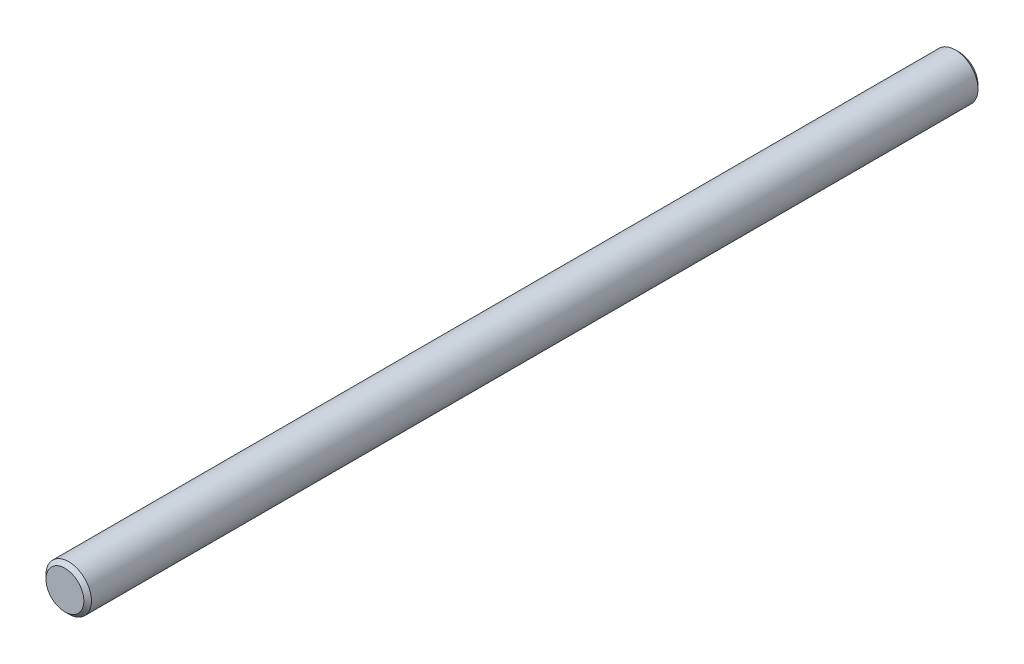
ISO-10303-21;
HEADER;
FILE_DESCRIPTION(('STEP AP214'),'2;1');
FILE_NAME('part.step','',(''),(''),'','','');
FILE_SCHEMA(('AUTOMOTIVE_DESIGN { 1 0 10303 214 1 1 1 1 }'));
ENDSEC;
DATA;
#1=APPLICATION_CONTEXT('core data for automotive mechanical design processes');
#2=APPLICATION_PROTOCOL_DEFINITION('international standard','automotive_design',2000,#1);
#3=PRODUCT_CONTEXT('',#1,'mechanical');
#4=PRODUCT('Part','Part','',(#3));
#5=PRODUCT_RELATED_PRODUCT_CATEGORY('part','',(#4));
#6=PRODUCT_DEFINITION_FORMATION('','',#4);
#7=PRODUCT_DEFINITION_CONTEXT('part definition',#1,'design');
#8=PRODUCT_DEFINITION('design','',#6,#7);
#9=PRODUCT_DEFINITION_SHAPE('','',#8);
#10=(LENGTH_UNIT() NAMED_UNIT(*) SI_UNIT(.MILLI.,.METRE.));
#11=(NAMED_UNIT(*) PLANE_ANGLE_UNIT() SI_UNIT($,.RADIAN.));
#12=(NAMED_UNIT(*) SI_UNIT($,.STERADIAN.) SOLID_ANGLE_UNIT());
#13=UNCERTAINTY_MEASURE_WITH_UNIT(LENGTH_MEASURE(1.E-05),#10,'distance_accuracy_value','');
#14=(GEOMETRIC_REPRESENTATION_CONTEXT(3) GLOBAL_UNCERTAINTY_ASSIGNED_CONTEXT((#13)) GLOBAL_UNIT_ASSIGNED_CONTEXT((#10,
#11,#12)) REPRESENTATION_CONTEXT('',''));
#15=CARTESIAN_POINT('',(0.,0.,0.));
#16=DIRECTION('',(0.,0.,1.));
#17=DIRECTION('',(1.,0.,0.));
#18=AXIS2_PLACEMENT_3D('',#15,#16,#17);
#19=CARTESIAN_POINT('',(0.,0.,118.));
#20=DIRECTION('',(0.,0.,-1.));
#21=DIRECTION('',(-1.,0.,0.));
#22=AXIS2_PLACEMENT_3D('',#19,#20,#21);
#23=CYLINDRICAL_SURFACE('',#22,3.);
#24=CARTESIAN_POINT('',(0.,0.,0.5));
#25=DIRECTION('',(0.,0.,1.));
#26=DIRECTION('',(1.,0.,0.));
#27=AXIS2_PLACEMENT_3D('',#24,#25,#26);
#28=CIRCLE('',#27,3.);
#29=CARTESIAN_POINT('',(3.,0.,0.5));
#30=VERTEX_POINT('',#29);
#31=EDGE_CURVE('E44',#30,#30,#28,.T.);
#32=ORIENTED_EDGE('',*,*,#31,.T.);
#33=EDGE_LOOP('',(#32));
#34=FACE_BOUND('',#33,.T.);
#35=CARTESIAN_POINT('',(0.,0.,117.5));
#36=DIRECTION('',(0.,0.,1.));
#37=DIRECTION('',(1.,0.,0.));
#38=AXIS2_PLACEMENT_3D('',#35,#36,#37);
#39=CIRCLE('',#38,3.);
#40=CARTESIAN_POINT('',(3.,0.,117.5));
#41=VERTEX_POINT('',#40);
#42=EDGE_CURVE('E48',#41,#41,#39,.F.);
#43=ORIENTED_EDGE('',*,*,#42,.T.);
#44=EDGE_LOOP('',(#43));
#45=FACE_BOUND('',#44,.T.);
#46=ADVANCED_FACE('F33',(#34,#45),#23,.T.);
#47=CARTESIAN_POINT('',(0.,0.,118.));
#48=DIRECTION('',(0.,0.,1.));
#49=DIRECTION('',(1.,0.,0.));
#50=AXIS2_PLACEMENT_3D('',#47,#48,#49);
#51=PLANE('',#50);
#52=CARTESIAN_POINT('',(0.,0.,118.));
#53=DIRECTION('',(0.,0.,1.));
#54=DIRECTION('',(1.,0.,0.));
#55=AXIS2_PLACEMENT_3D('',#52,#53,#54);
#56=CIRCLE('',#55,2.49999999999999);
#57=CARTESIAN_POINT('',(2.49999999999999,0.,118.));
#58=VERTEX_POINT('',#57);
#59=EDGE_CURVE('E10',#58,#58,#56,.T.);
#60=ORIENTED_EDGE('',*,*,#59,.T.);
#61=EDGE_LOOP('',(#60));
#62=FACE_BOUND('',#61,.T.);
#63=ADVANCED_FACE('F64',(#62),#51,.T.);
#64=CARTESIAN_POINT('',(0.,0.,0.));
#65=DIRECTION('',(0.,0.,1.));
#66=DIRECTION('',(1.,0.,0.));
#67=AXIS2_PLACEMENT_3D('',#64,#65,#66);
#68=PLANE('',#67);
#69=CARTESIAN_POINT('',(0.,0.,0.));
#70=DIRECTION('',(0.,0.,1.));
#71=DIRECTION('',(1.,0.,0.));
#72=AXIS2_PLACEMENT_3D('',#69,#70,#71);
#73=CIRCLE('',#72,2.5);
#74=CARTESIAN_POINT('',(2.5,0.,0.));
#75=VERTEX_POINT('',#74);
#76=EDGE_CURVE('E40',#75,#75,#73,.F.);
#77=ORIENTED_EDGE('',*,*,#76,.T.);
#78=EDGE_LOOP('',(#77));
#79=FACE_BOUND('',#78,.T.);
#80=ADVANCED_FACE('F61',(#79),#68,.F.);
#81=CARTESIAN_POINT('',(0.,0.,0.5));
#82=DIRECTION('',(0.,0.,1.));
#83=DIRECTION('',(1.,0.,0.));
#84=AXIS2_PLACEMENT_3D('',#81,#82,#83);
#85=CONICAL_SURFACE('',#84,3.,0.785398163397446);
#86=ORIENTED_EDGE('',*,*,#76,.F.);
#87=EDGE_LOOP('',(#86));
#88=FACE_BOUND('',#87,.T.);
#89=ORIENTED_EDGE('',*,*,#31,.F.);
#90=EDGE_LOOP('',(#89));
#91=FACE_BOUND('',#90,.T.);
#92=ADVANCED_FACE('F57',(#88,#91),#85,.T.);
#93=CARTESIAN_POINT('',(0.,0.,118.));
#94=DIRECTION('',(0.,0.,-1.));
#95=DIRECTION('',(-1.,0.,0.));
#96=AXIS2_PLACEMENT_3D('',#93,#94,#95);
#97=CONICAL_SURFACE('',#96,2.49999999999999,0.785398163397446);
#98=ORIENTED_EDGE('',*,*,#42,.F.);
#99=EDGE_LOOP('',(#98));
#100=FACE_BOUND('',#99,.T.);
#101=ORIENTED_EDGE('',*,*,#59,.F.);
#102=EDGE_LOOP('',(#101));
#103=FACE_BOUND('',#102,.T.);
#104=ADVANCED_FACE('F35',(#100,#103),#97,.T.);
#105=CLOSED_SHELL('',(#46,#63,#80,#92,#104));
#106=MANIFOLD_SOLID_BREP('B2',#105);
#107=ADVANCED_BREP_SHAPE_REPRESENTATION('',(#18,#106),#14);
#108=SHAPE_DEFINITION_REPRESENTATION(#9,#107);
ENDSEC;
END-ISO-10303-21;
